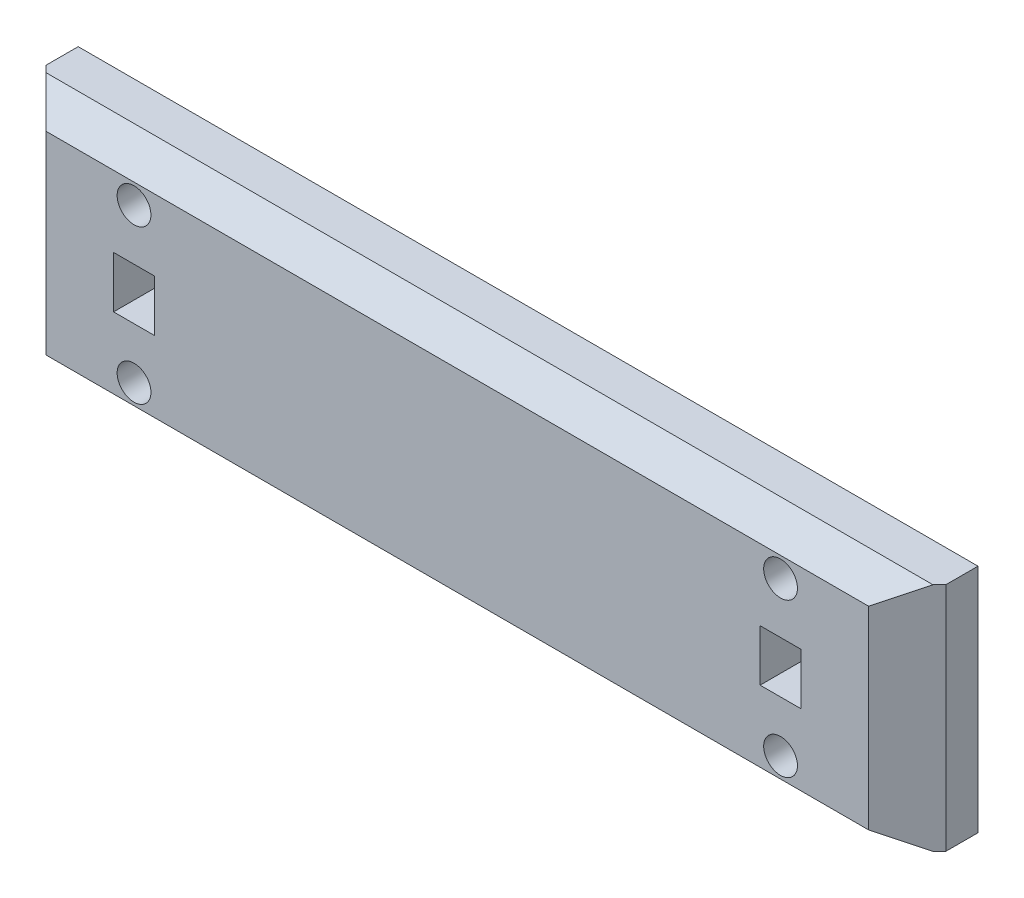
ISO-10303-21;
HEADER;
FILE_DESCRIPTION(('STEP AP214'),'2;1');
FILE_NAME('part.step','',(''),(''),'','','');
FILE_SCHEMA(('AUTOMOTIVE_DESIGN { 1 0 10303 214 1 1 1 1 }'));
ENDSEC;
DATA;
#1=APPLICATION_CONTEXT('core data for automotive mechanical design processes');
#2=APPLICATION_PROTOCOL_DEFINITION('international standard','automotive_design',2000,#1);
#3=PRODUCT_CONTEXT('',#1,'mechanical');
#4=PRODUCT('Part','Part','',(#3));
#5=PRODUCT_RELATED_PRODUCT_CATEGORY('part','',(#4));
#6=PRODUCT_DEFINITION_FORMATION('','',#4);
#7=PRODUCT_DEFINITION_CONTEXT('part definition',#1,'design');
#8=PRODUCT_DEFINITION('design','',#6,#7);
#9=PRODUCT_DEFINITION_SHAPE('','',#8);
#10=(LENGTH_UNIT() NAMED_UNIT(*) SI_UNIT(.MILLI.,.METRE.));
#11=(NAMED_UNIT(*) PLANE_ANGLE_UNIT() SI_UNIT($,.RADIAN.));
#12=(NAMED_UNIT(*) SI_UNIT($,.STERADIAN.) SOLID_ANGLE_UNIT());
#13=UNCERTAINTY_MEASURE_WITH_UNIT(LENGTH_MEASURE(1.E-05),#10,'distance_accuracy_value','');
#14=(GEOMETRIC_REPRESENTATION_CONTEXT(3) GLOBAL_UNCERTAINTY_ASSIGNED_CONTEXT((#13)) GLOBAL_UNIT_ASSIGNED_CONTEXT((#10,
#11,#12)) REPRESENTATION_CONTEXT('',''));
#15=CARTESIAN_POINT('',(0.,0.,0.));
#16=DIRECTION('',(0.,0.,1.));
#17=DIRECTION('',(1.,0.,0.));
#18=AXIS2_PLACEMENT_3D('',#15,#16,#17);
#19=CARTESIAN_POINT('',(-6.34999999999999,19.75,0.));
#20=DIRECTION('',(0.,0.,1.));
#21=DIRECTION('',(1.,0.,0.));
#22=AXIS2_PLACEMENT_3D('',#19,#20,#21);
#23=CYLINDRICAL_SURFACE('',#22,2.75);
#24=CARTESIAN_POINT('',(-6.34999999999999,19.75,0.));
#25=DIRECTION('',(0.,0.,1.));
#26=DIRECTION('',(1.,0.,0.));
#27=AXIS2_PLACEMENT_3D('',#24,#25,#26);
#28=CIRCLE('',#27,2.75);
#29=CARTESIAN_POINT('',(-3.59999999999999,19.75,0.));
#30=VERTEX_POINT('',#29);
#31=EDGE_CURVE('E215',#30,#30,#28,.T.);
#32=ORIENTED_EDGE('',*,*,#31,.F.);
#33=EDGE_LOOP('',(#32));
#34=FACE_BOUND('',#33,.T.);
#35=CARTESIAN_POINT('',(-6.34999999999999,19.75,12.));
#36=DIRECTION('',(0.,0.,1.));
#37=DIRECTION('',(1.,0.,0.));
#38=AXIS2_PLACEMENT_3D('',#35,#36,#37);
#39=CIRCLE('',#38,2.75);
#40=CARTESIAN_POINT('',(-3.59999999999999,19.75,12.));
#41=VERTEX_POINT('',#40);
#42=EDGE_CURVE('E326',#41,#41,#39,.F.);
#43=ORIENTED_EDGE('',*,*,#42,.F.);
#44=EDGE_LOOP('',(#43));
#45=FACE_BOUND('',#44,.T.);
#46=ADVANCED_FACE('F41',(#34,#45),#23,.F.);
#47=CARTESIAN_POINT('',(-6.34999999999999,-28.,0.));
#48=DIRECTION('',(0.,0.,1.));
#49=DIRECTION('',(1.,0.,0.));
#50=AXIS2_PLACEMENT_3D('',#47,#48,#49);
#51=CYLINDRICAL_SURFACE('',#50,2.75);
#52=CARTESIAN_POINT('',(-6.34999999999999,-28.,0.));
#53=DIRECTION('',(0.,0.,1.));
#54=DIRECTION('',(1.,0.,0.));
#55=AXIS2_PLACEMENT_3D('',#52,#53,#54);
#56=CIRCLE('',#55,2.75);
#57=CARTESIAN_POINT('',(-3.6,-28.,0.));
#58=VERTEX_POINT('',#57);
#59=EDGE_CURVE('E212',#58,#58,#56,.T.);
#60=ORIENTED_EDGE('',*,*,#59,.F.);
#61=EDGE_LOOP('',(#60));
#62=FACE_BOUND('',#61,.T.);
#63=CARTESIAN_POINT('',(-6.34999999999999,-28.,12.));
#64=DIRECTION('',(0.,0.,1.));
#65=DIRECTION('',(1.,0.,0.));
#66=AXIS2_PLACEMENT_3D('',#63,#64,#65);
#67=CIRCLE('',#66,2.75);
#68=CARTESIAN_POINT('',(-3.6,-28.,12.));
#69=VERTEX_POINT('',#68);
#70=EDGE_CURVE('E323',#69,#69,#67,.F.);
#71=ORIENTED_EDGE('',*,*,#70,.F.);
#72=EDGE_LOOP('',(#71));
#73=FACE_BOUND('',#72,.T.);
#74=ADVANCED_FACE('F396',(#62,#73),#51,.F.);
#75=CARTESIAN_POINT('',(194.545,-28.,0.));
#76=DIRECTION('',(0.,0.,1.));
#77=DIRECTION('',(1.,0.,0.));
#78=AXIS2_PLACEMENT_3D('',#75,#76,#77);
#79=CYLINDRICAL_SURFACE('',#78,2.74999999999998);
#80=CARTESIAN_POINT('',(194.545,-28.,0.));
#81=DIRECTION('',(0.,0.,1.));
#82=DIRECTION('',(-1.,0.,0.));
#83=AXIS2_PLACEMENT_3D('',#80,#81,#82);
#84=CIRCLE('',#83,2.74999999999998);
#85=CARTESIAN_POINT('',(191.795,-28.,0.));
#86=VERTEX_POINT('',#85);
#87=EDGE_CURVE('E216',#86,#86,#84,.T.);
#88=ORIENTED_EDGE('',*,*,#87,.F.);
#89=EDGE_LOOP('',(#88));
#90=FACE_BOUND('',#89,.T.);
#91=CARTESIAN_POINT('',(194.545,-28.,12.));
#92=DIRECTION('',(0.,0.,1.));
#93=DIRECTION('',(1.,0.,0.));
#94=AXIS2_PLACEMENT_3D('',#91,#92,#93);
#95=CIRCLE('',#94,2.74999999999998);
#96=CARTESIAN_POINT('',(197.295,-28.,12.));
#97=VERTEX_POINT('',#96);
#98=EDGE_CURVE('E319',#97,#97,#95,.F.);
#99=ORIENTED_EDGE('',*,*,#98,.F.);
#100=EDGE_LOOP('',(#99));
#101=FACE_BOUND('',#100,.T.);
#102=ADVANCED_FACE('F403',(#90,#101),#79,.F.);
#103=CARTESIAN_POINT('',(194.545,19.75,0.));
#104=DIRECTION('',(0.,0.,1.));
#105=DIRECTION('',(1.,0.,0.));
#106=AXIS2_PLACEMENT_3D('',#103,#104,#105);
#107=CYLINDRICAL_SURFACE('',#106,2.75000000000001);
#108=CARTESIAN_POINT('',(194.545,19.75,0.));
#109=DIRECTION('',(0.,0.,1.));
#110=DIRECTION('',(-1.,0.,0.));
#111=AXIS2_PLACEMENT_3D('',#108,#109,#110);
#112=CIRCLE('',#111,2.75000000000001);
#113=CARTESIAN_POINT('',(191.795,19.75,0.));
#114=VERTEX_POINT('',#113);
#115=EDGE_CURVE('E219',#114,#114,#112,.T.);
#116=ORIENTED_EDGE('',*,*,#115,.F.);
#117=EDGE_LOOP('',(#116));
#118=FACE_BOUND('',#117,.T.);
#119=CARTESIAN_POINT('',(194.545,19.75,12.));
#120=DIRECTION('',(0.,0.,1.));
#121=DIRECTION('',(1.,0.,0.));
#122=AXIS2_PLACEMENT_3D('',#119,#120,#121);
#123=CIRCLE('',#122,2.75000000000001);
#124=CARTESIAN_POINT('',(197.295,19.75,12.));
#125=VERTEX_POINT('',#124);
#126=EDGE_CURVE('E316',#125,#125,#123,.F.);
#127=ORIENTED_EDGE('',*,*,#126,.F.);
#128=EDGE_LOOP('',(#127));
#129=FACE_BOUND('',#128,.T.);
#130=ADVANCED_FACE('F410',(#118,#129),#107,.F.);
#131=CARTESIAN_POINT('',(0.,0.,22.));
#132=DIRECTION('',(0.,0.,1.));
#133=DIRECTION('',(1.,0.,0.));
#134=AXIS2_PLACEMENT_3D('',#131,#132,#133);
#135=PLANE('',#134);
#136=CARTESIAN_POINT('',(-6.34999999999999,-28.,22.));
#137=DIRECTION('',(0.,0.,1.));
#138=DIRECTION('',(1.,0.,0.));
#139=AXIS2_PLACEMENT_3D('',#136,#137,#138);
#140=CIRCLE('',#139,5.25);
#141=CARTESIAN_POINT('',(-1.09999999999999,-28.,22.));
#142=VERTEX_POINT('',#141);
#143=EDGE_CURVE('E727',#142,#142,#140,.T.);
#144=ORIENTED_EDGE('',*,*,#143,.F.);
#145=EDGE_LOOP('',(#144));
#146=FACE_BOUND('',#145,.T.);
#147=CARTESIAN_POINT('',(194.545,19.75,22.));
#148=DIRECTION('',(0.,0.,1.));
#149=DIRECTION('',(1.,0.,0.));
#150=AXIS2_PLACEMENT_3D('',#147,#148,#149);
#151=CIRCLE('',#150,5.25);
#152=CARTESIAN_POINT('',(199.795,19.75,22.));
#153=VERTEX_POINT('',#152);
#154=EDGE_CURVE('E733',#153,#153,#151,.T.);
#155=ORIENTED_EDGE('',*,*,#154,.F.);
#156=EDGE_LOOP('',(#155));
#157=FACE_BOUND('',#156,.T.);
#158=CARTESIAN_POINT('',(194.545,-28.,22.));
#159=DIRECTION('',(0.,0.,1.));
#160=DIRECTION('',(1.,0.,0.));
#161=AXIS2_PLACEMENT_3D('',#158,#159,#160);
#162=CIRCLE('',#161,5.25);
#163=CARTESIAN_POINT('',(199.795,-28.,22.));
#164=VERTEX_POINT('',#163);
#165=EDGE_CURVE('E734',#164,#164,#162,.T.);
#166=ORIENTED_EDGE('',*,*,#165,.F.);
#167=EDGE_LOOP('',(#166));
#168=FACE_BOUND('',#167,.T.);
#169=CARTESIAN_POINT('',(-6.34999999999999,19.75,22.));
#170=DIRECTION('',(0.,0.,1.));
#171=DIRECTION('',(1.,0.,0.));
#172=AXIS2_PLACEMENT_3D('',#169,#170,#171);
#173=CIRCLE('',#172,5.25);
#174=CARTESIAN_POINT('',(-1.09999999999999,19.75,22.));
#175=VERTEX_POINT('',#174);
#176=EDGE_CURVE('E724',#175,#175,#173,.T.);
#177=ORIENTED_EDGE('',*,*,#176,.F.);
#178=EDGE_LOOP('',(#177));
#179=FACE_BOUND('',#178,.T.);
#180=DIRECTION('',(-1.,0.,0.));
#181=VECTOR('',#180,1.);
#182=CARTESIAN_POINT('',(-45.7,25.9764973081037,22.));
#183=LINE('',#182,#181);
#184=CARTESIAN_POINT('',(221.895,25.9764973081038,22.));
#185=VERTEX_POINT('',#184);
#186=CARTESIAN_POINT('',(-33.7,25.9764973081037,22.));
#187=VERTEX_POINT('',#186);
#188=EDGE_CURVE('E308',#185,#187,#183,.T.);
#189=ORIENTED_EDGE('',*,*,#188,.T.);
#190=DIRECTION('',(0.,-1.,0.));
#191=VECTOR('',#190,1.);
#192=CARTESIAN_POINT('',(-33.7,-34.2264973081037,22.));
#193=LINE('',#192,#191);
#194=CARTESIAN_POINT('',(-33.7,-34.2264973081037,22.));
#195=VERTEX_POINT('',#194);
#196=EDGE_CURVE('E332',#187,#195,#193,.T.);
#197=ORIENTED_EDGE('',*,*,#196,.T.);
#198=DIRECTION('',(1.,0.,0.));
#199=VECTOR('',#198,1.);
#200=CARTESIAN_POINT('',(233.895,-34.2264973081037,22.));
#201=LINE('',#200,#199);
#202=CARTESIAN_POINT('',(221.895,-34.2264973081037,22.));
#203=VERTEX_POINT('',#202);
#204=EDGE_CURVE('E305',#195,#203,#201,.T.);
#205=ORIENTED_EDGE('',*,*,#204,.T.);
#206=DIRECTION('',(0.,1.,0.));
#207=VECTOR('',#206,1.);
#208=CARTESIAN_POINT('',(221.895,25.9764973081037,22.));
#209=LINE('',#208,#207);
#210=EDGE_CURVE('E315',#203,#185,#209,.T.);
#211=ORIENTED_EDGE('',*,*,#210,.T.);
#212=EDGE_LOOP('',(#189,#197,#205,#211));
#213=FACE_BOUND('',#212,.T.);
#214=DIRECTION('',(1.,0.,0.));
#215=VECTOR('',#214,1.);
#216=CARTESIAN_POINT('',(-12.7,-12.125,22.));
#217=LINE('',#216,#215);
#218=CARTESIAN_POINT('',(-12.7,-12.125,22.));
#219=VERTEX_POINT('',#218);
#220=CARTESIAN_POINT('',(0.,-12.125,22.));
#221=VERTEX_POINT('',#220);
#222=EDGE_CURVE('E258',#219,#221,#217,.T.);
#223=ORIENTED_EDGE('',*,*,#222,.F.);
#224=DIRECTION('',(0.,-1.,0.));
#225=VECTOR('',#224,1.);
#226=CARTESIAN_POINT('',(-12.7,3.875,22.));
#227=LINE('',#226,#225);
#228=CARTESIAN_POINT('',(-12.7,3.875,22.));
#229=VERTEX_POINT('',#228);
#230=EDGE_CURVE('E256',#229,#219,#227,.T.);
#231=ORIENTED_EDGE('',*,*,#230,.F.);
#232=DIRECTION('',(-1.,0.,0.));
#233=VECTOR('',#232,1.);
#234=CARTESIAN_POINT('',(-12.7,3.875,22.));
#235=LINE('',#234,#233);
#236=CARTESIAN_POINT('',(0.,3.875,22.));
#237=VERTEX_POINT('',#236);
#238=EDGE_CURVE('E264',#237,#229,#235,.T.);
#239=ORIENTED_EDGE('',*,*,#238,.F.);
#240=DIRECTION('',(0.,1.,0.));
#241=VECTOR('',#240,1.);
#242=CARTESIAN_POINT('',(0.,3.875,22.));
#243=LINE('',#242,#241);
#244=EDGE_CURVE('E261',#221,#237,#243,.T.);
#245=ORIENTED_EDGE('',*,*,#244,.F.);
#246=EDGE_LOOP('',(#223,#231,#239,#245));
#247=FACE_BOUND('',#246,.T.);
#248=DIRECTION('',(-1.,0.,0.));
#249=VECTOR('',#248,1.);
#250=CARTESIAN_POINT('',(200.895,3.87500000000003,22.));
#251=LINE('',#250,#249);
#252=CARTESIAN_POINT('',(200.895,3.87500000000003,22.));
#253=VERTEX_POINT('',#252);
#254=CARTESIAN_POINT('',(188.195,3.87500000000003,22.));
#255=VERTEX_POINT('',#254);
#256=EDGE_CURVE('E227',#253,#255,#251,.T.);
#257=ORIENTED_EDGE('',*,*,#256,.F.);
#258=DIRECTION('',(0.,1.,0.));
#259=VECTOR('',#258,1.);
#260=CARTESIAN_POINT('',(200.895,3.87500000000003,22.));
#261=LINE('',#260,#259);
#262=CARTESIAN_POINT('',(200.895,-12.125,22.));
#263=VERTEX_POINT('',#262);
#264=EDGE_CURVE('E225',#263,#253,#261,.T.);
#265=ORIENTED_EDGE('',*,*,#264,.F.);
#266=DIRECTION('',(1.,0.,0.));
#267=VECTOR('',#266,1.);
#268=CARTESIAN_POINT('',(200.895,-12.125,22.));
#269=LINE('',#268,#267);
#270=CARTESIAN_POINT('',(188.195,-12.125,22.));
#271=VERTEX_POINT('',#270);
#272=EDGE_CURVE('E233',#271,#263,#269,.T.);
#273=ORIENTED_EDGE('',*,*,#272,.F.);
#274=DIRECTION('',(0.,-1.,0.));
#275=VECTOR('',#274,1.);
#276=CARTESIAN_POINT('',(188.195,3.87500000000003,22.));
#277=LINE('',#276,#275);
#278=EDGE_CURVE('E230',#255,#271,#277,.T.);
#279=ORIENTED_EDGE('',*,*,#278,.F.);
#280=EDGE_LOOP('',(#257,#265,#273,#279));
#281=FACE_BOUND('',#280,.T.);
#282=ADVANCED_FACE('F354',(#146,#157,#168,#179,#213,#247,#281),#135,.T.);
#283=CARTESIAN_POINT('',(0.,0.,0.));
#284=DIRECTION('',(0.,0.,1.));
#285=DIRECTION('',(1.,0.,0.));
#286=AXIS2_PLACEMENT_3D('',#283,#284,#285);
#287=PLANE('',#286);
#288=ORIENTED_EDGE('',*,*,#115,.T.);
#289=EDGE_LOOP('',(#288));
#290=FACE_BOUND('',#289,.T.);
#291=ORIENTED_EDGE('',*,*,#87,.T.);
#292=EDGE_LOOP('',(#291));
#293=FACE_BOUND('',#292,.T.);
#294=ORIENTED_EDGE('',*,*,#59,.T.);
#295=EDGE_LOOP('',(#294));
#296=FACE_BOUND('',#295,.T.);
#297=ORIENTED_EDGE('',*,*,#31,.T.);
#298=EDGE_LOOP('',(#297));
#299=FACE_BOUND('',#298,.T.);
#300=DIRECTION('',(0.,-1.,0.));
#301=VECTOR('',#300,1.);
#302=CARTESIAN_POINT('',(-12.7,3.875,0.));
#303=LINE('',#302,#301);
#304=CARTESIAN_POINT('',(-12.7,3.875,0.));
#305=VERTEX_POINT('',#304);
#306=CARTESIAN_POINT('',(-12.7,-12.125,0.));
#307=VERTEX_POINT('',#306);
#308=EDGE_CURVE('E255',#305,#307,#303,.T.);
#309=ORIENTED_EDGE('',*,*,#308,.T.);
#310=DIRECTION('',(1.,0.,0.));
#311=VECTOR('',#310,1.);
#312=CARTESIAN_POINT('',(-12.7,-12.125,0.));
#313=LINE('',#312,#311);
#314=CARTESIAN_POINT('',(0.,-12.125,0.));
#315=VERTEX_POINT('',#314);
#316=EDGE_CURVE('E269',#307,#315,#313,.T.);
#317=ORIENTED_EDGE('',*,*,#316,.T.);
#318=DIRECTION('',(0.,1.,0.));
#319=VECTOR('',#318,1.);
#320=CARTESIAN_POINT('',(0.,3.875,0.));
#321=LINE('',#320,#319);
#322=CARTESIAN_POINT('',(0.,3.875,0.));
#323=VERTEX_POINT('',#322);
#324=EDGE_CURVE('E272',#315,#323,#321,.T.);
#325=ORIENTED_EDGE('',*,*,#324,.T.);
#326=DIRECTION('',(-1.,0.,0.));
#327=VECTOR('',#326,1.);
#328=CARTESIAN_POINT('',(-12.7,3.875,0.));
#329=LINE('',#328,#327);
#330=EDGE_CURVE('E259',#323,#305,#329,.T.);
#331=ORIENTED_EDGE('',*,*,#330,.T.);
#332=EDGE_LOOP('',(#309,#317,#325,#331));
#333=FACE_BOUND('',#332,.T.);
#334=DIRECTION('',(1.,0.,0.));
#335=VECTOR('',#334,1.);
#336=CARTESIAN_POINT('',(233.895,-40.,0.));
#337=LINE('',#336,#335);
#338=CARTESIAN_POINT('',(178.195,-40.,0.));
#339=VERTEX_POINT('',#338);
#340=CARTESIAN_POINT('',(233.895,-40.,0.));
#341=VERTEX_POINT('',#340);
#342=EDGE_CURVE('E289',#339,#341,#337,.T.);
#343=ORIENTED_EDGE('',*,*,#342,.F.);
#344=DIRECTION('',(0.,-1.,0.));
#345=VECTOR('',#344,1.);
#346=CARTESIAN_POINT('',(178.195,-40.,0.));
#347=LINE('',#346,#345);
#348=CARTESIAN_POINT('',(178.195,19.75,0.));
#349=VERTEX_POINT('',#348);
#350=EDGE_CURVE('E329',#349,#339,#347,.T.);
#351=ORIENTED_EDGE('',*,*,#350,.F.);
#352=DIRECTION('',(1.,0.,0.));
#353=VECTOR('',#352,1.);
#354=CARTESIAN_POINT('',(178.195,19.75,0.));
#355=LINE('',#354,#353);
#356=CARTESIAN_POINT('',(10.,19.7500000000001,0.));
#357=VERTEX_POINT('',#356);
#358=EDGE_CURVE('E718',#357,#349,#355,.T.);
#359=ORIENTED_EDGE('',*,*,#358,.F.);
#360=DIRECTION('',(0.,1.,0.));
#361=VECTOR('',#360,1.);
#362=CARTESIAN_POINT('',(10.,-40.,0.));
#363=LINE('',#362,#361);
#364=CARTESIAN_POINT('',(10.,-40.,0.));
#365=VERTEX_POINT('',#364);
#366=EDGE_CURVE('E716',#365,#357,#363,.T.);
#367=ORIENTED_EDGE('',*,*,#366,.F.);
#368=CARTESIAN_POINT('',(-45.7,-40.,0.));
#369=VERTEX_POINT('',#368);
#370=EDGE_CURVE('E204',#369,#365,#337,.T.);
#371=ORIENTED_EDGE('',*,*,#370,.F.);
#372=DIRECTION('',(0.,-1.,0.));
#373=VECTOR('',#372,1.);
#374=CARTESIAN_POINT('',(-45.7,31.75,0.));
#375=LINE('',#374,#373);
#376=CARTESIAN_POINT('',(-45.7,31.75,0.));
#377=VERTEX_POINT('',#376);
#378=EDGE_CURVE('E286',#377,#369,#375,.T.);
#379=ORIENTED_EDGE('',*,*,#378,.F.);
#380=DIRECTION('',(-1.,0.,0.));
#381=VECTOR('',#380,1.);
#382=CARTESIAN_POINT('',(-12.,31.75,0.));
#383=LINE('',#382,#381);
#384=CARTESIAN_POINT('',(233.895,31.75,0.));
#385=VERTEX_POINT('',#384);
#386=EDGE_CURVE('E294',#385,#377,#383,.T.);
#387=ORIENTED_EDGE('',*,*,#386,.F.);
#388=DIRECTION('',(0.,1.,0.));
#389=VECTOR('',#388,1.);
#390=CARTESIAN_POINT('',(233.895,31.75,0.));
#391=LINE('',#390,#389);
#392=EDGE_CURVE('E291',#341,#385,#391,.T.);
#393=ORIENTED_EDGE('',*,*,#392,.F.);
#394=EDGE_LOOP('',(#343,#351,#359,#367,#371,#379,#387,#393));
#395=FACE_BOUND('',#394,.T.);
#396=DIRECTION('',(0.,1.,0.));
#397=VECTOR('',#396,1.);
#398=CARTESIAN_POINT('',(200.895,3.87500000000003,0.));
#399=LINE('',#398,#397);
#400=CARTESIAN_POINT('',(200.895,-12.125,0.));
#401=VERTEX_POINT('',#400);
#402=CARTESIAN_POINT('',(200.895,3.87500000000003,0.));
#403=VERTEX_POINT('',#402);
#404=EDGE_CURVE('E224',#401,#403,#399,.T.);
#405=ORIENTED_EDGE('',*,*,#404,.T.);
#406=DIRECTION('',(-1.,0.,0.));
#407=VECTOR('',#406,1.);
#408=CARTESIAN_POINT('',(200.895,3.87500000000003,0.));
#409=LINE('',#408,#407);
#410=CARTESIAN_POINT('',(188.195,3.87500000000003,0.));
#411=VERTEX_POINT('',#410);
#412=EDGE_CURVE('E238',#403,#411,#409,.T.);
#413=ORIENTED_EDGE('',*,*,#412,.T.);
#414=DIRECTION('',(0.,-1.,0.));
#415=VECTOR('',#414,1.);
#416=CARTESIAN_POINT('',(188.195,3.87500000000003,0.));
#417=LINE('',#416,#415);
#418=CARTESIAN_POINT('',(188.195,-12.125,0.));
#419=VERTEX_POINT('',#418);
#420=EDGE_CURVE('E241',#411,#419,#417,.T.);
#421=ORIENTED_EDGE('',*,*,#420,.T.);
#422=DIRECTION('',(1.,0.,0.));
#423=VECTOR('',#422,1.);
#424=CARTESIAN_POINT('',(200.895,-12.125,0.));
#425=LINE('',#424,#423);
#426=EDGE_CURVE('E228',#419,#401,#425,.T.);
#427=ORIENTED_EDGE('',*,*,#426,.T.);
#428=EDGE_LOOP('',(#405,#413,#421,#427));
#429=FACE_BOUND('',#428,.T.);
#430=ADVANCED_FACE('F380',(#290,#293,#296,#299,#333,#395,#429),#287,.F.);
#431=CARTESIAN_POINT('',(-45.7,31.75,22.));
#432=DIRECTION('',(1.,0.,0.));
#433=DIRECTION('',(0.,1.,0.));
#434=AXIS2_PLACEMENT_3D('',#431,#432,#433);
#435=PLANE('',#434);
#436=DIRECTION('',(0.,0.,-1.));
#437=VECTOR('',#436,1.);
#438=CARTESIAN_POINT('',(-45.7,-40.,22.));
#439=LINE('',#438,#437);
#440=CARTESIAN_POINT('',(-45.7,-40.,9.99999999999993));
#441=VERTEX_POINT('',#440);
#442=EDGE_CURVE('E301',#441,#369,#439,.T.);
#443=ORIENTED_EDGE('',*,*,#442,.F.);
#444=DIRECTION('',(0.,1.,0.));
#445=VECTOR('',#444,1.);
#446=CARTESIAN_POINT('',(-45.7,25.9764973081037,9.99999999999993));
#447=LINE('',#446,#445);
#448=CARTESIAN_POINT('',(-45.7,31.75,9.99999999999993));
#449=VERTEX_POINT('',#448);
#450=EDGE_CURVE('E343',#441,#449,#447,.T.);
#451=ORIENTED_EDGE('',*,*,#450,.T.);
#452=DIRECTION('',(0.,0.,-1.));
#453=VECTOR('',#452,1.);
#454=CARTESIAN_POINT('',(-45.7,31.75,22.));
#455=LINE('',#454,#453);
#456=EDGE_CURVE('E303',#449,#377,#455,.T.);
#457=ORIENTED_EDGE('',*,*,#456,.T.);
#458=ORIENTED_EDGE('',*,*,#378,.T.);
#459=EDGE_LOOP('',(#443,#451,#457,#458));
#460=FACE_BOUND('',#459,.T.);
#461=ADVANCED_FACE('F383',(#460),#435,.F.);
#462=CARTESIAN_POINT('',(233.895,-40.,22.));
#463=DIRECTION('',(0.,1.,0.));
#464=DIRECTION('',(0.,0.,1.));
#465=AXIS2_PLACEMENT_3D('',#462,#463,#464);
#466=PLANE('',#465);
#467=DIRECTION('',(-1.,0.,0.));
#468=VECTOR('',#467,1.);
#469=CARTESIAN_POINT('',(-45.7,-40.,11.9999999999998));
#470=LINE('',#469,#468);
#471=CARTESIAN_POINT('',(231.895,-40.,11.9999999999998));
#472=VERTEX_POINT('',#471);
#473=CARTESIAN_POINT('',(-43.7000000000001,-40.,11.9999999999998));
#474=VERTEX_POINT('',#473);
#475=EDGE_CURVE('E313',#472,#474,#470,.T.);
#476=ORIENTED_EDGE('',*,*,#475,.T.);
#477=DIRECTION('',(-0.707106781186546,0.,-0.707106781186549));
#478=VECTOR('',#477,1.);
#479=CARTESIAN_POINT('',(-33.7,-40.,22.));
#480=LINE('',#479,#478);
#481=EDGE_CURVE('E341',#474,#441,#480,.T.);
#482=ORIENTED_EDGE('',*,*,#481,.T.);
#483=ORIENTED_EDGE('',*,*,#442,.T.);
#484=ORIENTED_EDGE('',*,*,#370,.T.);
#485=DIRECTION('',(0.,0.,-1.));
#486=VECTOR('',#485,1.);
#487=CARTESIAN_POINT('',(10.,-40.,8.));
#488=LINE('',#487,#486);
#489=CARTESIAN_POINT('',(10.,-40.,8.));
#490=VERTEX_POINT('',#489);
#491=EDGE_CURVE('E183',#490,#365,#488,.T.);
#492=ORIENTED_EDGE('',*,*,#491,.F.);
#493=DIRECTION('',(-1.,0.,0.));
#494=VECTOR('',#493,1.);
#495=CARTESIAN_POINT('',(178.195,-40.,8.));
#496=LINE('',#495,#494);
#497=CARTESIAN_POINT('',(178.195,-40.,8.));
#498=VERTEX_POINT('',#497);
#499=EDGE_CURVE('E190',#498,#490,#496,.T.);
#500=ORIENTED_EDGE('',*,*,#499,.F.);
#501=DIRECTION('',(0.,0.,-1.));
#502=VECTOR('',#501,1.);
#503=CARTESIAN_POINT('',(178.195,-40.,8.));
#504=LINE('',#503,#502);
#505=EDGE_CURVE('E205',#498,#339,#504,.T.);
#506=ORIENTED_EDGE('',*,*,#505,.T.);
#507=ORIENTED_EDGE('',*,*,#342,.T.);
#508=DIRECTION('',(0.,0.,-1.));
#509=VECTOR('',#508,1.);
#510=CARTESIAN_POINT('',(233.895,-40.,22.));
#511=LINE('',#510,#509);
#512=CARTESIAN_POINT('',(233.895,-40.,9.9999999999999));
#513=VERTEX_POINT('',#512);
#514=EDGE_CURVE('E299',#513,#341,#511,.T.);
#515=ORIENTED_EDGE('',*,*,#514,.F.);
#516=DIRECTION('',(-0.707106781186545,0.,0.70710678118655));
#517=VECTOR('',#516,1.);
#518=CARTESIAN_POINT('',(221.895,-40.,22.));
#519=LINE('',#518,#517);
#520=EDGE_CURVE('E339',#513,#472,#519,.T.);
#521=ORIENTED_EDGE('',*,*,#520,.T.);
#522=EDGE_LOOP('',(#476,#482,#483,#484,#492,#500,#506,#507,#515,#521));
#523=FACE_BOUND('',#522,.T.);
#524=ADVANCED_FACE('F202',(#523),#466,.F.);
#525=CARTESIAN_POINT('',(233.895,31.75,22.));
#526=DIRECTION('',(-1.,0.,0.));
#527=DIRECTION('',(0.,-1.,0.));
#528=AXIS2_PLACEMENT_3D('',#525,#526,#527);
#529=PLANE('',#528);
#530=DIRECTION('',(0.,0.,-1.));
#531=VECTOR('',#530,1.);
#532=CARTESIAN_POINT('',(233.895,31.75,22.));
#533=LINE('',#532,#531);
#534=CARTESIAN_POINT('',(233.895,31.75,9.9999999999999));
#535=VERTEX_POINT('',#534);
#536=EDGE_CURVE('E297',#535,#385,#533,.T.);
#537=ORIENTED_EDGE('',*,*,#536,.F.);
#538=DIRECTION('',(0.,-1.,0.));
#539=VECTOR('',#538,1.);
#540=CARTESIAN_POINT('',(233.895,-34.2264973081037,9.9999999999999));
#541=LINE('',#540,#539);
#542=EDGE_CURVE('E11',#535,#513,#541,.T.);
#543=ORIENTED_EDGE('',*,*,#542,.T.);
#544=ORIENTED_EDGE('',*,*,#514,.T.);
#545=ORIENTED_EDGE('',*,*,#392,.T.);
#546=EDGE_LOOP('',(#537,#543,#544,#545));
#547=FACE_BOUND('',#546,.T.);
#548=ADVANCED_FACE('F372',(#547),#529,.F.);
#549=CARTESIAN_POINT('',(-12.,31.75,22.));
#550=DIRECTION('',(0.,-1.,0.));
#551=DIRECTION('',(1.,0.,0.));
#552=AXIS2_PLACEMENT_3D('',#549,#550,#551);
#553=PLANE('',#552);
#554=ORIENTED_EDGE('',*,*,#456,.F.);
#555=DIRECTION('',(0.707106781186546,0.,0.707106781186549));
#556=VECTOR('',#555,1.);
#557=CARTESIAN_POINT('',(-33.7,31.75,22.));
#558=LINE('',#557,#556);
#559=CARTESIAN_POINT('',(-43.7,31.75,11.9999999999999));
#560=VERTEX_POINT('',#559);
#561=EDGE_CURVE('E346',#449,#560,#558,.T.);
#562=ORIENTED_EDGE('',*,*,#561,.T.);
#563=DIRECTION('',(1.,0.,0.));
#564=VECTOR('',#563,1.);
#565=CARTESIAN_POINT('',(233.895,31.75,11.9999999999999));
#566=LINE('',#565,#564);
#567=CARTESIAN_POINT('',(231.895,31.75,11.9999999999999));
#568=VERTEX_POINT('',#567);
#569=EDGE_CURVE('E311',#560,#568,#566,.T.);
#570=ORIENTED_EDGE('',*,*,#569,.T.);
#571=DIRECTION('',(0.707106781186545,0.,-0.70710678118655));
#572=VECTOR('',#571,1.);
#573=CARTESIAN_POINT('',(221.895,31.75,22.));
#574=LINE('',#573,#572);
#575=EDGE_CURVE('E57',#568,#535,#574,.T.);
#576=ORIENTED_EDGE('',*,*,#575,.T.);
#577=ORIENTED_EDGE('',*,*,#536,.T.);
#578=ORIENTED_EDGE('',*,*,#386,.T.);
#579=EDGE_LOOP('',(#554,#562,#570,#576,#577,#578));
#580=FACE_BOUND('',#579,.T.);
#581=ADVANCED_FACE('F376',(#580),#553,.F.);
#582=CARTESIAN_POINT('',(-12.7,3.875,22.));
#583=DIRECTION('',(1.,0.,0.));
#584=DIRECTION('',(0.,1.,0.));
#585=AXIS2_PLACEMENT_3D('',#582,#583,#584);
#586=PLANE('',#585);
#587=ORIENTED_EDGE('',*,*,#308,.F.);
#588=DIRECTION('',(0.,0.,-1.));
#589=VECTOR('',#588,1.);
#590=CARTESIAN_POINT('',(-12.7,3.875,22.));
#591=LINE('',#590,#589);
#592=EDGE_CURVE('E266',#229,#305,#591,.T.);
#593=ORIENTED_EDGE('',*,*,#592,.F.);
#594=ORIENTED_EDGE('',*,*,#230,.T.);
#595=DIRECTION('',(0.,0.,-1.));
#596=VECTOR('',#595,1.);
#597=CARTESIAN_POINT('',(-12.7,-12.125,22.));
#598=LINE('',#597,#596);
#599=EDGE_CURVE('E283',#219,#307,#598,.T.);
#600=ORIENTED_EDGE('',*,*,#599,.T.);
#601=EDGE_LOOP('',(#587,#593,#594,#600));
#602=FACE_BOUND('',#601,.T.);
#603=ADVANCED_FACE('F440',(#602),#586,.T.);
#604=CARTESIAN_POINT('',(-12.7,-12.125,22.));
#605=DIRECTION('',(0.,1.,0.));
#606=DIRECTION('',(-1.,0.,0.));
#607=AXIS2_PLACEMENT_3D('',#604,#605,#606);
#608=PLANE('',#607);
#609=ORIENTED_EDGE('',*,*,#316,.F.);
#610=ORIENTED_EDGE('',*,*,#599,.F.);
#611=ORIENTED_EDGE('',*,*,#222,.T.);
#612=DIRECTION('',(0.,0.,-1.));
#613=VECTOR('',#612,1.);
#614=CARTESIAN_POINT('',(0.,-12.125,22.));
#615=LINE('',#614,#613);
#616=EDGE_CURVE('E281',#221,#315,#615,.T.);
#617=ORIENTED_EDGE('',*,*,#616,.T.);
#618=EDGE_LOOP('',(#609,#610,#611,#617));
#619=FACE_BOUND('',#618,.T.);
#620=ADVANCED_FACE('F436',(#619),#608,.T.);
#621=CARTESIAN_POINT('',(0.,3.875,22.));
#622=DIRECTION('',(-1.,0.,0.));
#623=DIRECTION('',(0.,-1.,0.));
#624=AXIS2_PLACEMENT_3D('',#621,#622,#623);
#625=PLANE('',#624);
#626=ORIENTED_EDGE('',*,*,#324,.F.);
#627=ORIENTED_EDGE('',*,*,#616,.F.);
#628=ORIENTED_EDGE('',*,*,#244,.T.);
#629=DIRECTION('',(0.,0.,-1.));
#630=VECTOR('',#629,1.);
#631=CARTESIAN_POINT('',(0.,3.875,22.));
#632=LINE('',#631,#630);
#633=EDGE_CURVE('E279',#237,#323,#632,.T.);
#634=ORIENTED_EDGE('',*,*,#633,.T.);
#635=EDGE_LOOP('',(#626,#627,#628,#634));
#636=FACE_BOUND('',#635,.T.);
#637=ADVANCED_FACE('F432',(#636),#625,.T.);
#638=CARTESIAN_POINT('',(-12.7,3.875,22.));
#639=DIRECTION('',(0.,-1.,0.));
#640=DIRECTION('',(1.,0.,0.));
#641=AXIS2_PLACEMENT_3D('',#638,#639,#640);
#642=PLANE('',#641);
#643=ORIENTED_EDGE('',*,*,#330,.F.);
#644=ORIENTED_EDGE('',*,*,#633,.F.);
#645=ORIENTED_EDGE('',*,*,#238,.T.);
#646=ORIENTED_EDGE('',*,*,#592,.T.);
#647=EDGE_LOOP('',(#643,#644,#645,#646));
#648=FACE_BOUND('',#647,.T.);
#649=ADVANCED_FACE('F428',(#648),#642,.T.);
#650=CARTESIAN_POINT('',(200.895,3.87500000000003,22.));
#651=DIRECTION('',(-1.,0.,0.));
#652=DIRECTION('',(0.,0.,1.));
#653=AXIS2_PLACEMENT_3D('',#650,#651,#652);
#654=PLANE('',#653);
#655=ORIENTED_EDGE('',*,*,#404,.F.);
#656=DIRECTION('',(0.,0.,-1.));
#657=VECTOR('',#656,1.);
#658=CARTESIAN_POINT('',(200.895,-12.125,22.));
#659=LINE('',#658,#657);
#660=EDGE_CURVE('E235',#263,#401,#659,.T.);
#661=ORIENTED_EDGE('',*,*,#660,.F.);
#662=ORIENTED_EDGE('',*,*,#264,.T.);
#663=DIRECTION('',(0.,0.,-1.));
#664=VECTOR('',#663,1.);
#665=CARTESIAN_POINT('',(200.895,3.87500000000003,22.));
#666=LINE('',#665,#664);
#667=EDGE_CURVE('E252',#253,#403,#666,.T.);
#668=ORIENTED_EDGE('',*,*,#667,.T.);
#669=EDGE_LOOP('',(#655,#661,#662,#668));
#670=FACE_BOUND('',#669,.T.);
#671=ADVANCED_FACE('F424',(#670),#654,.T.);
#672=CARTESIAN_POINT('',(200.895,3.87500000000003,22.));
#673=DIRECTION('',(0.,-1.,0.));
#674=DIRECTION('',(1.,0.,0.));
#675=AXIS2_PLACEMENT_3D('',#672,#673,#674);
#676=PLANE('',#675);
#677=ORIENTED_EDGE('',*,*,#412,.F.);
#678=ORIENTED_EDGE('',*,*,#667,.F.);
#679=ORIENTED_EDGE('',*,*,#256,.T.);
#680=DIRECTION('',(0.,0.,-1.));
#681=VECTOR('',#680,1.);
#682=CARTESIAN_POINT('',(188.195,3.87500000000003,22.));
#683=LINE('',#682,#681);
#684=EDGE_CURVE('E250',#255,#411,#683,.T.);
#685=ORIENTED_EDGE('',*,*,#684,.T.);
#686=EDGE_LOOP('',(#677,#678,#679,#685));
#687=FACE_BOUND('',#686,.T.);
#688=ADVANCED_FACE('F420',(#687),#676,.T.);
#689=CARTESIAN_POINT('',(188.195,3.87500000000003,22.));
#690=DIRECTION('',(1.,0.,0.));
#691=DIRECTION('',(0.,0.,-1.));
#692=AXIS2_PLACEMENT_3D('',#689,#690,#691);
#693=PLANE('',#692);
#694=ORIENTED_EDGE('',*,*,#420,.F.);
#695=ORIENTED_EDGE('',*,*,#684,.F.);
#696=ORIENTED_EDGE('',*,*,#278,.T.);
#697=DIRECTION('',(0.,0.,-1.));
#698=VECTOR('',#697,1.);
#699=CARTESIAN_POINT('',(188.195,-12.125,22.));
#700=LINE('',#699,#698);
#701=EDGE_CURVE('E248',#271,#419,#700,.T.);
#702=ORIENTED_EDGE('',*,*,#701,.T.);
#703=EDGE_LOOP('',(#694,#695,#696,#702));
#704=FACE_BOUND('',#703,.T.);
#705=ADVANCED_FACE('F416',(#704),#693,.T.);
#706=CARTESIAN_POINT('',(200.895,-12.125,22.));
#707=DIRECTION('',(0.,1.,0.));
#708=DIRECTION('',(-1.,0.,0.));
#709=AXIS2_PLACEMENT_3D('',#706,#707,#708);
#710=PLANE('',#709);
#711=ORIENTED_EDGE('',*,*,#426,.F.);
#712=ORIENTED_EDGE('',*,*,#701,.F.);
#713=ORIENTED_EDGE('',*,*,#272,.T.);
#714=ORIENTED_EDGE('',*,*,#660,.T.);
#715=EDGE_LOOP('',(#711,#712,#713,#714));
#716=FACE_BOUND('',#715,.T.);
#717=ADVANCED_FACE('F412',(#716),#710,.T.);
#718=CARTESIAN_POINT('',(178.195,-40.,8.));
#719=DIRECTION('',(1.,0.,0.));
#720=DIRECTION('',(0.,0.,-1.));
#721=AXIS2_PLACEMENT_3D('',#718,#719,#720);
#722=PLANE('',#721);
#723=ORIENTED_EDGE('',*,*,#350,.T.);
#724=ORIENTED_EDGE('',*,*,#505,.F.);
#725=DIRECTION('',(0.,-1.,0.));
#726=VECTOR('',#725,1.);
#727=CARTESIAN_POINT('',(178.195,-40.,8.));
#728=LINE('',#727,#726);
#729=CARTESIAN_POINT('',(178.195,19.75,8.));
#730=VERTEX_POINT('',#729);
#731=EDGE_CURVE('E195',#730,#498,#728,.T.);
#732=ORIENTED_EDGE('',*,*,#731,.F.);
#733=DIRECTION('',(0.,0.,-1.));
#734=VECTOR('',#733,1.);
#735=CARTESIAN_POINT('',(178.195,19.75,8.));
#736=LINE('',#735,#734);
#737=EDGE_CURVE('E207',#730,#349,#736,.T.);
#738=ORIENTED_EDGE('',*,*,#737,.T.);
#739=EDGE_LOOP('',(#723,#724,#732,#738));
#740=FACE_BOUND('',#739,.T.);
#741=ADVANCED_FACE('F415',(#740),#722,.F.);
#742=CARTESIAN_POINT('',(178.195,19.75,8.));
#743=DIRECTION('',(0.,1.,0.));
#744=DIRECTION('',(-1.,0.,0.));
#745=AXIS2_PLACEMENT_3D('',#742,#743,#744);
#746=PLANE('',#745);
#747=ORIENTED_EDGE('',*,*,#358,.T.);
#748=ORIENTED_EDGE('',*,*,#737,.F.);
#749=DIRECTION('',(1.,0.,0.));
#750=VECTOR('',#749,1.);
#751=CARTESIAN_POINT('',(178.195,19.75,8.));
#752=LINE('',#751,#750);
#753=CARTESIAN_POINT('',(10.,19.7500000000001,8.));
#754=VERTEX_POINT('',#753);
#755=EDGE_CURVE('E189',#754,#730,#752,.T.);
#756=ORIENTED_EDGE('',*,*,#755,.F.);
#757=DIRECTION('',(0.,0.,-1.));
#758=VECTOR('',#757,1.);
#759=CARTESIAN_POINT('',(10.,19.7500000000001,8.));
#760=LINE('',#759,#758);
#761=EDGE_CURVE('E185',#754,#357,#760,.T.);
#762=ORIENTED_EDGE('',*,*,#761,.T.);
#763=EDGE_LOOP('',(#747,#748,#756,#762));
#764=FACE_BOUND('',#763,.T.);
#765=ADVANCED_FACE('F602',(#764),#746,.F.);
#766=CARTESIAN_POINT('',(10.,-40.,8.));
#767=DIRECTION('',(-1.,0.,0.));
#768=DIRECTION('',(0.,0.,1.));
#769=AXIS2_PLACEMENT_3D('',#766,#767,#768);
#770=PLANE('',#769);
#771=ORIENTED_EDGE('',*,*,#366,.T.);
#772=ORIENTED_EDGE('',*,*,#761,.F.);
#773=DIRECTION('',(0.,1.,0.));
#774=VECTOR('',#773,1.);
#775=CARTESIAN_POINT('',(10.,-40.,8.));
#776=LINE('',#775,#774);
#777=EDGE_CURVE('E178',#490,#754,#776,.T.);
#778=ORIENTED_EDGE('',*,*,#777,.F.);
#779=ORIENTED_EDGE('',*,*,#491,.T.);
#780=EDGE_LOOP('',(#771,#772,#778,#779));
#781=FACE_BOUND('',#780,.T.);
#782=ADVANCED_FACE('F181',(#781),#770,.F.);
#783=CARTESIAN_POINT('',(0.,0.,8.));
#784=DIRECTION('',(0.,0.,1.));
#785=DIRECTION('',(1.,0.,0.));
#786=AXIS2_PLACEMENT_3D('',#783,#784,#785);
#787=PLANE('',#786);
#788=ORIENTED_EDGE('',*,*,#731,.T.);
#789=ORIENTED_EDGE('',*,*,#499,.T.);
#790=ORIENTED_EDGE('',*,*,#777,.T.);
#791=ORIENTED_EDGE('',*,*,#755,.T.);
#792=EDGE_LOOP('',(#788,#789,#790,#791));
#793=FACE_BOUND('',#792,.T.);
#794=ADVANCED_FACE('F193',(#793),#787,.F.);
#795=CARTESIAN_POINT('',(0.,25.9764973081037,22.));
#796=DIRECTION('',(0.,0.866025403784439,0.499999999999999));
#797=DIRECTION('',(1.,0.,0.));
#798=AXIS2_PLACEMENT_3D('',#795,#796,#797);
#799=PLANE('',#798);
#800=ORIENTED_EDGE('',*,*,#569,.F.);
#801=DIRECTION('',(0.654653670707976,-0.377964473009227,0.654653670707979));
#802=VECTOR('',#801,1.);
#803=CARTESIAN_POINT('',(-19.2571428571429,17.6379098488079,36.4428571428571));
#804=LINE('',#803,#802);
#805=EDGE_CURVE('E50',#560,#187,#804,.T.);
#806=ORIENTED_EDGE('',*,*,#805,.T.);
#807=ORIENTED_EDGE('',*,*,#188,.F.);
#808=DIRECTION('',(0.654653670707975,0.377964473009227,-0.654653670707979));
#809=VECTOR('',#808,1.);
#810=CARTESIAN_POINT('',(126.797142857143,-28.9282761126812,117.097857142857));
#811=LINE('',#810,#809);
#812=EDGE_CURVE('E65',#185,#568,#811,.T.);
#813=ORIENTED_EDGE('',*,*,#812,.T.);
#814=EDGE_LOOP('',(#800,#806,#807,#813));
#815=FACE_BOUND('',#814,.T.);
#816=ADVANCED_FACE('F349',(#815),#799,.T.);
#817=CARTESIAN_POINT('',(0.,-34.2264973081037,22.));
#818=DIRECTION('',(0.,-0.86602540378444,0.499999999999998));
#819=DIRECTION('',(-1.,0.,0.));
#820=AXIS2_PLACEMENT_3D('',#817,#818,#819);
#821=PLANE('',#820);
#822=ORIENTED_EDGE('',*,*,#204,.F.);
#823=DIRECTION('',(-0.654653670707976,-0.377964473009226,-0.654653670707979));
#824=VECTOR('',#823,1.);
#825=CARTESIAN_POINT('',(-19.2571428571429,-25.8879098488078,36.4428571428571));
#826=LINE('',#825,#824);
#827=EDGE_CURVE('E337',#195,#474,#826,.T.);
#828=ORIENTED_EDGE('',*,*,#827,.T.);
#829=ORIENTED_EDGE('',*,*,#475,.F.);
#830=DIRECTION('',(-0.654653670707975,0.377964473009227,0.654653670707979));
#831=VECTOR('',#830,1.);
#832=CARTESIAN_POINT('',(126.797142857143,20.6782761126812,117.097857142857));
#833=LINE('',#832,#831);
#834=EDGE_CURVE('E335',#472,#203,#833,.T.);
#835=ORIENTED_EDGE('',*,*,#834,.T.);
#836=EDGE_LOOP('',(#822,#828,#829,#835));
#837=FACE_BOUND('',#836,.T.);
#838=ADVANCED_FACE('F363',(#837),#821,.T.);
#839=CARTESIAN_POINT('',(194.545,19.75,12.));
#840=DIRECTION('',(0.,0.,1.));
#841=DIRECTION('',(1.,0.,0.));
#842=AXIS2_PLACEMENT_3D('',#839,#840,#841);
#843=PLANE('',#842);
#844=CARTESIAN_POINT('',(194.545,19.75,12.));
#845=DIRECTION('',(0.,0.,1.));
#846=DIRECTION('',(1.,0.,0.));
#847=AXIS2_PLACEMENT_3D('',#844,#845,#846);
#848=CIRCLE('',#847,5.25);
#849=CARTESIAN_POINT('',(199.795,19.75,12.));
#850=VERTEX_POINT('',#849);
#851=EDGE_CURVE('E730',#850,#850,#848,.T.);
#852=ORIENTED_EDGE('',*,*,#851,.T.);
#853=EDGE_LOOP('',(#852));
#854=FACE_BOUND('',#853,.T.);
#855=ORIENTED_EDGE('',*,*,#126,.T.);
#856=EDGE_LOOP('',(#855));
#857=FACE_BOUND('',#856,.T.);
#858=ADVANCED_FACE('F475',(#854,#857),#843,.T.);
#859=CARTESIAN_POINT('',(194.545,19.75,12.));
#860=DIRECTION('',(0.,0.,1.));
#861=DIRECTION('',(1.,0.,0.));
#862=AXIS2_PLACEMENT_3D('',#859,#860,#861);
#863=CYLINDRICAL_SURFACE('',#862,5.25);
#864=ORIENTED_EDGE('',*,*,#851,.F.);
#865=EDGE_LOOP('',(#864));
#866=FACE_BOUND('',#865,.T.);
#867=ORIENTED_EDGE('',*,*,#154,.T.);
#868=EDGE_LOOP('',(#867));
#869=FACE_BOUND('',#868,.T.);
#870=ADVANCED_FACE('F545',(#866,#869),#863,.F.);
#871=CARTESIAN_POINT('',(194.545,-28.,12.));
#872=DIRECTION('',(0.,0.,1.));
#873=DIRECTION('',(1.,0.,0.));
#874=AXIS2_PLACEMENT_3D('',#871,#872,#873);
#875=PLANE('',#874);
#876=CARTESIAN_POINT('',(194.545,-28.,12.));
#877=DIRECTION('',(0.,0.,1.));
#878=DIRECTION('',(1.,0.,0.));
#879=AXIS2_PLACEMENT_3D('',#876,#877,#878);
#880=CIRCLE('',#879,5.25);
#881=CARTESIAN_POINT('',(199.795,-28.,12.));
#882=VERTEX_POINT('',#881);
#883=EDGE_CURVE('E742',#882,#882,#880,.T.);
#884=ORIENTED_EDGE('',*,*,#883,.T.);
#885=EDGE_LOOP('',(#884));
#886=FACE_BOUND('',#885,.T.);
#887=ORIENTED_EDGE('',*,*,#98,.T.);
#888=EDGE_LOOP('',(#887));
#889=FACE_BOUND('',#888,.T.);
#890=ADVANCED_FACE('F536',(#886,#889),#875,.T.);
#891=CARTESIAN_POINT('',(194.545,-28.,12.));
#892=DIRECTION('',(0.,0.,1.));
#893=DIRECTION('',(1.,0.,0.));
#894=AXIS2_PLACEMENT_3D('',#891,#892,#893);
#895=CYLINDRICAL_SURFACE('',#894,5.25);
#896=ORIENTED_EDGE('',*,*,#883,.F.);
#897=EDGE_LOOP('',(#896));
#898=FACE_BOUND('',#897,.T.);
#899=ORIENTED_EDGE('',*,*,#165,.T.);
#900=EDGE_LOOP('',(#899));
#901=FACE_BOUND('',#900,.T.);
#902=ADVANCED_FACE('F527',(#898,#901),#895,.F.);
#903=CARTESIAN_POINT('',(-6.34999999999999,-28.,12.));
#904=DIRECTION('',(0.,0.,1.));
#905=DIRECTION('',(1.,0.,0.));
#906=AXIS2_PLACEMENT_3D('',#903,#904,#905);
#907=PLANE('',#906);
#908=CARTESIAN_POINT('',(-6.34999999999999,-28.,12.));
#909=DIRECTION('',(0.,0.,1.));
#910=DIRECTION('',(1.,0.,0.));
#911=AXIS2_PLACEMENT_3D('',#908,#909,#910);
#912=CIRCLE('',#911,5.25);
#913=CARTESIAN_POINT('',(-1.09999999999999,-28.,12.));
#914=VERTEX_POINT('',#913);
#915=EDGE_CURVE('E737',#914,#914,#912,.T.);
#916=ORIENTED_EDGE('',*,*,#915,.T.);
#917=EDGE_LOOP('',(#916));
#918=FACE_BOUND('',#917,.T.);
#919=ORIENTED_EDGE('',*,*,#70,.T.);
#920=EDGE_LOOP('',(#919));
#921=FACE_BOUND('',#920,.T.);
#922=ADVANCED_FACE('F518',(#918,#921),#907,.T.);
#923=CARTESIAN_POINT('',(-6.34999999999999,-28.,12.));
#924=DIRECTION('',(0.,0.,1.));
#925=DIRECTION('',(1.,0.,0.));
#926=AXIS2_PLACEMENT_3D('',#923,#924,#925);
#927=CYLINDRICAL_SURFACE('',#926,5.25);
#928=ORIENTED_EDGE('',*,*,#915,.F.);
#929=EDGE_LOOP('',(#928));
#930=FACE_BOUND('',#929,.T.);
#931=ORIENTED_EDGE('',*,*,#143,.T.);
#932=EDGE_LOOP('',(#931));
#933=FACE_BOUND('',#932,.T.);
#934=ADVANCED_FACE('F509',(#930,#933),#927,.F.);
#935=CARTESIAN_POINT('',(-6.34999999999999,19.75,12.));
#936=DIRECTION('',(0.,0.,1.));
#937=DIRECTION('',(1.,0.,0.));
#938=AXIS2_PLACEMENT_3D('',#935,#936,#937);
#939=PLANE('',#938);
#940=CARTESIAN_POINT('',(-6.34999999999999,19.75,12.));
#941=DIRECTION('',(0.,0.,1.));
#942=DIRECTION('',(1.,0.,0.));
#943=AXIS2_PLACEMENT_3D('',#940,#941,#942);
#944=CIRCLE('',#943,5.25);
#945=CARTESIAN_POINT('',(-1.09999999999999,19.75,12.));
#946=VERTEX_POINT('',#945);
#947=EDGE_CURVE('E320',#946,#946,#944,.T.);
#948=ORIENTED_EDGE('',*,*,#947,.T.);
#949=EDGE_LOOP('',(#948));
#950=FACE_BOUND('',#949,.T.);
#951=ORIENTED_EDGE('',*,*,#42,.T.);
#952=EDGE_LOOP('',(#951));
#953=FACE_BOUND('',#952,.T.);
#954=ADVANCED_FACE('F500',(#950,#953),#939,.T.);
#955=CARTESIAN_POINT('',(-6.34999999999999,19.75,12.));
#956=DIRECTION('',(0.,0.,1.));
#957=DIRECTION('',(1.,0.,0.));
#958=AXIS2_PLACEMENT_3D('',#955,#956,#957);
#959=CYLINDRICAL_SURFACE('',#958,5.25);
#960=ORIENTED_EDGE('',*,*,#947,.F.);
#961=EDGE_LOOP('',(#960));
#962=FACE_BOUND('',#961,.T.);
#963=ORIENTED_EDGE('',*,*,#176,.T.);
#964=EDGE_LOOP('',(#963));
#965=FACE_BOUND('',#964,.T.);
#966=ADVANCED_FACE('F484',(#962,#965),#959,.F.);
#967=CARTESIAN_POINT('',(-33.7,0.,22.));
#968=DIRECTION('',(-0.707106781186549,0.,0.707106781186546));
#969=DIRECTION('',(0.,1.,0.));
#970=AXIS2_PLACEMENT_3D('',#967,#968,#969);
#971=PLANE('',#970);
#972=ORIENTED_EDGE('',*,*,#561,.F.);
#973=ORIENTED_EDGE('',*,*,#450,.F.);
#974=ORIENTED_EDGE('',*,*,#481,.F.);
#975=ORIENTED_EDGE('',*,*,#827,.F.);
#976=ORIENTED_EDGE('',*,*,#196,.F.);
#977=ORIENTED_EDGE('',*,*,#805,.F.);
#978=EDGE_LOOP('',(#972,#973,#974,#975,#976,#977));
#979=FACE_BOUND('',#978,.T.);
#980=ADVANCED_FACE('F358',(#979),#971,.T.);
#981=CARTESIAN_POINT('',(221.895,0.,22.));
#982=DIRECTION('',(0.70710678118655,0.,0.707106781186545));
#983=DIRECTION('',(0.,-1.,0.));
#984=AXIS2_PLACEMENT_3D('',#981,#982,#983);
#985=PLANE('',#984);
#986=ORIENTED_EDGE('',*,*,#520,.F.);
#987=ORIENTED_EDGE('',*,*,#542,.F.);
#988=ORIENTED_EDGE('',*,*,#575,.F.);
#989=ORIENTED_EDGE('',*,*,#812,.F.);
#990=ORIENTED_EDGE('',*,*,#210,.F.);
#991=ORIENTED_EDGE('',*,*,#834,.F.);
#992=EDGE_LOOP('',(#986,#987,#988,#989,#990,#991));
#993=FACE_BOUND('',#992,.T.);
#994=ADVANCED_FACE('F44',(#993),#985,.T.);
#995=CLOSED_SHELL('',(#46,#74,#102,#130,#282,#430,#461,#524,#548,#581,#603,#620,#637,#649,#671,
#688,#705,#717,#741,#765,#782,#794,#816,#838,#858,#870,#890,#902,#922,#934,#954,#966,#980,#994));
#996=MANIFOLD_SOLID_BREP('B2',#995);
#997=ADVANCED_BREP_SHAPE_REPRESENTATION('',(#18,#996),#14);
#998=SHAPE_DEFINITION_REPRESENTATION(#9,#997);
ENDSEC;
END-ISO-10303-21;
